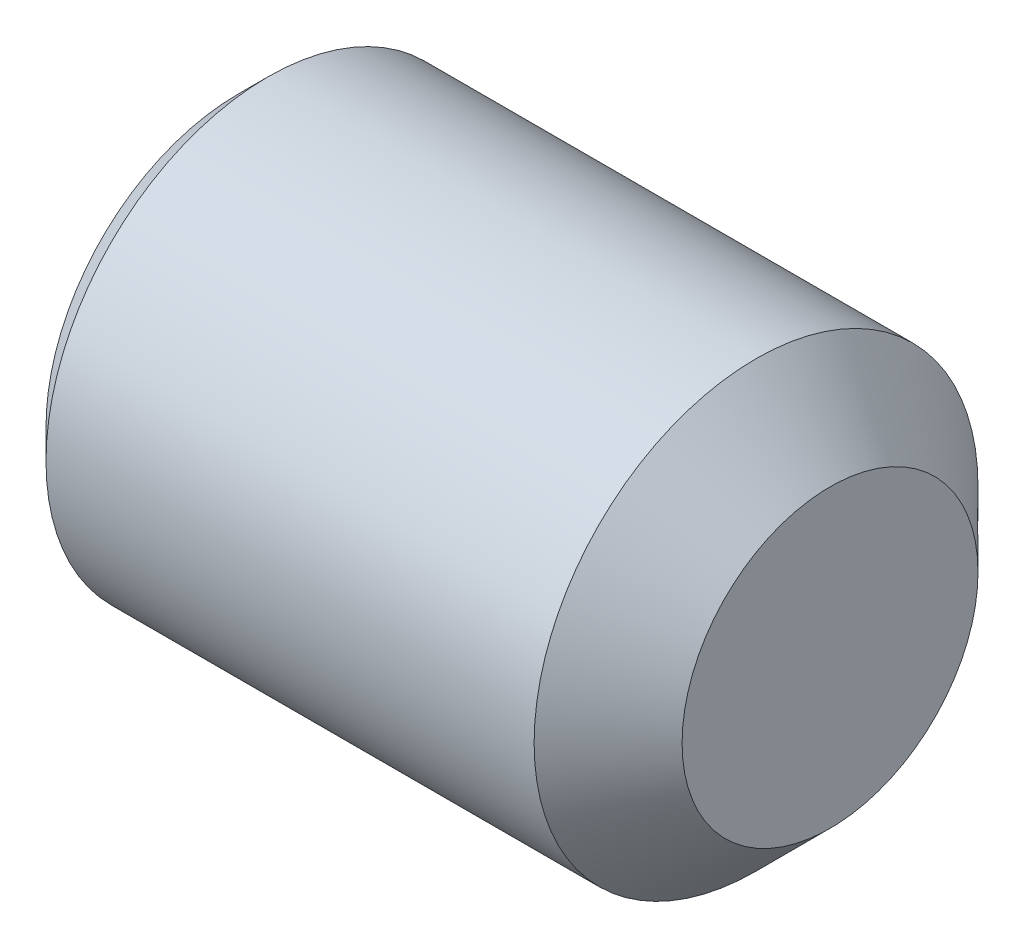
ISO-10303-21;
HEADER;
FILE_DESCRIPTION(('STEP AP214'),'2;1');
FILE_NAME('part.step','',(''),(''),'','','');
FILE_SCHEMA(('AUTOMOTIVE_DESIGN { 1 0 10303 214 1 1 1 1 }'));
ENDSEC;
DATA;
#1=APPLICATION_CONTEXT('core data for automotive mechanical design processes');
#2=APPLICATION_PROTOCOL_DEFINITION('international standard','automotive_design',2000,#1);
#3=PRODUCT_CONTEXT('',#1,'mechanical');
#4=PRODUCT('Part','Part','',(#3));
#5=PRODUCT_RELATED_PRODUCT_CATEGORY('part','',(#4));
#6=PRODUCT_DEFINITION_FORMATION('','',#4);
#7=PRODUCT_DEFINITION_CONTEXT('part definition',#1,'design');
#8=PRODUCT_DEFINITION('design','',#6,#7);
#9=PRODUCT_DEFINITION_SHAPE('','',#8);
#10=(LENGTH_UNIT() NAMED_UNIT(*) SI_UNIT(.MILLI.,.METRE.));
#11=(NAMED_UNIT(*) PLANE_ANGLE_UNIT() SI_UNIT($,.RADIAN.));
#12=(NAMED_UNIT(*) SI_UNIT($,.STERADIAN.) SOLID_ANGLE_UNIT());
#13=UNCERTAINTY_MEASURE_WITH_UNIT(LENGTH_MEASURE(1.E-05),#10,'distance_accuracy_value','');
#14=(GEOMETRIC_REPRESENTATION_CONTEXT(3) GLOBAL_UNCERTAINTY_ASSIGNED_CONTEXT((#13)) GLOBAL_UNIT_ASSIGNED_CONTEXT((#10,
#11,#12)) REPRESENTATION_CONTEXT('',''));
#15=CARTESIAN_POINT('',(0.,0.,0.));
#16=DIRECTION('',(0.,0.,1.));
#17=DIRECTION('',(1.,0.,0.));
#18=AXIS2_PLACEMENT_3D('',#15,#16,#17);
#19=CARTESIAN_POINT('',(1.2000000000002,0.,0.));
#20=DIRECTION('',(-1.,0.,0.));
#21=DIRECTION('',(0.,0.,1.));
#22=AXIS2_PLACEMENT_3D('',#19,#20,#21);
#23=CONICAL_SURFACE('',#22,0.74911197427352,1.04719755119653);
#24=CARTESIAN_POINT('',(1.63250000000026,0.,-3.33066907387547E-13));
#25=VERTEX_POINT('',#24);
#26=VERTEX_LOOP('',#25);
#27=FACE_BOUND('',#26,.T.);
#28=CARTESIAN_POINT('',(1.20000000000007,0.,0.));
#29=DIRECTION('',(-1.,0.,0.));
#30=DIRECTION('',(0.,0.,1.));
#31=AXIS2_PLACEMENT_3D('',#28,#29,#30);
#32=CIRCLE('',#31,0.749111974273742);
#33=CARTESIAN_POINT('',(1.20000000000004,0.37455598713682,-0.648750000000088));
#34=VERTEX_POINT('',#33);
#35=CARTESIAN_POINT('',(1.20000000000004,-0.37455598713682,-0.648750000000088));
#36=VERTEX_POINT('',#35);
#37=EDGE_CURVE('E139',#34,#36,#32,.T.);
#38=ORIENTED_EDGE('',*,*,#37,.T.);
#39=CARTESIAN_POINT('',(1.20000000000007,0.,0.));
#40=DIRECTION('',(-1.,0.,0.));
#41=DIRECTION('',(0.,0.,1.));
#42=AXIS2_PLACEMENT_3D('',#39,#40,#41);
#43=CIRCLE('',#42,0.749111974273742);
#44=CARTESIAN_POINT('',(1.20000000000004,-0.749111974273641,0.));
#45=VERTEX_POINT('',#44);
#46=EDGE_CURVE('E93',#36,#45,#43,.T.);
#47=ORIENTED_EDGE('',*,*,#46,.T.);
#48=CARTESIAN_POINT('',(1.20000000000007,0.,0.));
#49=DIRECTION('',(-1.,0.,0.));
#50=DIRECTION('',(0.,0.,1.));
#51=AXIS2_PLACEMENT_3D('',#48,#49,#50);
#52=CIRCLE('',#51,0.749111974273742);
#53=CARTESIAN_POINT('',(1.20000000000004,-0.37455598713682,0.648750000000088));
#54=VERTEX_POINT('',#53);
#55=EDGE_CURVE('E88',#45,#54,#52,.T.);
#56=ORIENTED_EDGE('',*,*,#55,.T.);
#57=CARTESIAN_POINT('',(1.20000000000007,0.,0.));
#58=DIRECTION('',(-1.,0.,0.));
#59=DIRECTION('',(0.,0.,1.));
#60=AXIS2_PLACEMENT_3D('',#57,#58,#59);
#61=CIRCLE('',#60,0.749111974273742);
#62=CARTESIAN_POINT('',(1.20000000000004,0.37455598713682,0.648750000000087));
#63=VERTEX_POINT('',#62);
#64=EDGE_CURVE('E20',#54,#63,#61,.T.);
#65=ORIENTED_EDGE('',*,*,#64,.T.);
#66=CARTESIAN_POINT('',(1.20000000000007,0.,0.));
#67=DIRECTION('',(-1.,0.,0.));
#68=DIRECTION('',(0.,0.,1.));
#69=AXIS2_PLACEMENT_3D('',#66,#67,#68);
#70=CIRCLE('',#69,0.749111974273742);
#71=CARTESIAN_POINT('',(1.20000000000004,0.749111974273641,0.));
#72=VERTEX_POINT('',#71);
#73=EDGE_CURVE('E114',#63,#72,#70,.T.);
#74=ORIENTED_EDGE('',*,*,#73,.T.);
#75=CARTESIAN_POINT('',(1.20000000000007,0.,0.));
#76=DIRECTION('',(-1.,0.,0.));
#77=DIRECTION('',(0.,0.,1.));
#78=AXIS2_PLACEMENT_3D('',#75,#76,#77);
#79=CIRCLE('',#78,0.749111974273742);
#80=EDGE_CURVE('E141',#72,#34,#79,.T.);
#81=ORIENTED_EDGE('',*,*,#80,.T.);
#82=EDGE_LOOP('',(#38,#47,#56,#65,#74,#81));
#83=FACE_BOUND('',#82,.T.);
#84=ADVANCED_FACE('F17',(#27,#83),#23,.F.);
#85=CARTESIAN_POINT('',(1.2,0.749111974273539,-1.2975));
#86=DIRECTION('',(1.,0.,0.));
#87=DIRECTION('',(0.,0.,-1.));
#88=AXIS2_PLACEMENT_3D('',#85,#86,#87);
#89=PLANE('',#88);
#90=DIRECTION('',(0.,-0.866025403784439,-0.5));
#91=VECTOR('',#90,1.);
#92=CARTESIAN_POINT('',(1.2,-0.749111974273539,0.4325));
#93=LINE('',#92,#91);
#94=CARTESIAN_POINT('',(1.2,0.,0.864999999999999));
#95=VERTEX_POINT('',#94);
#96=EDGE_CURVE('E106',#54,#95,#93,.F.);
#97=ORIENTED_EDGE('',*,*,#96,.T.);
#98=DIRECTION('',(0.,-0.866025403784439,0.5));
#99=VECTOR('',#98,1.);
#100=CARTESIAN_POINT('',(1.2,0.,0.864999999999999));
#101=LINE('',#100,#99);
#102=EDGE_CURVE('E112',#95,#63,#101,.F.);
#103=ORIENTED_EDGE('',*,*,#102,.T.);
#104=ORIENTED_EDGE('',*,*,#64,.F.);
#105=EDGE_LOOP('',(#97,#103,#104));
#106=FACE_BOUND('',#105,.T.);
#107=ADVANCED_FACE('F109',(#106),#89,.F.);
#108=CARTESIAN_POINT('',(1.2,0.749111974273539,-1.2975));
#109=DIRECTION('',(1.,0.,0.));
#110=DIRECTION('',(0.,0.,-1.));
#111=AXIS2_PLACEMENT_3D('',#108,#109,#110);
#112=PLANE('',#111);
#113=DIRECTION('',(0.,-0.866025403784439,0.5));
#114=VECTOR('',#113,1.);
#115=CARTESIAN_POINT('',(1.2,0.,0.864999999999999));
#116=LINE('',#115,#114);
#117=CARTESIAN_POINT('',(1.2,0.74911197427354,0.432499999999999));
#118=VERTEX_POINT('',#117);
#119=EDGE_CURVE('E150',#63,#118,#116,.F.);
#120=ORIENTED_EDGE('',*,*,#119,.T.);
#121=DIRECTION('',(0.,0.,1.));
#122=VECTOR('',#121,1.);
#123=CARTESIAN_POINT('',(1.2,0.74911197427354,0.432499999999999));
#124=LINE('',#123,#122);
#125=EDGE_CURVE('E148',#118,#72,#124,.F.);
#126=ORIENTED_EDGE('',*,*,#125,.T.);
#127=ORIENTED_EDGE('',*,*,#73,.F.);
#128=EDGE_LOOP('',(#120,#126,#127));
#129=FACE_BOUND('',#128,.T.);
#130=ADVANCED_FACE('F149',(#129),#112,.F.);
#131=CARTESIAN_POINT('',(1.2,0.749111974273539,-1.2975));
#132=DIRECTION('',(1.,0.,0.));
#133=DIRECTION('',(0.,0.,-1.));
#134=AXIS2_PLACEMENT_3D('',#131,#132,#133);
#135=PLANE('',#134);
#136=DIRECTION('',(0.,0.,1.));
#137=VECTOR('',#136,1.);
#138=CARTESIAN_POINT('',(1.2,0.74911197427354,0.432499999999999));
#139=LINE('',#138,#137);
#140=CARTESIAN_POINT('',(1.2,0.74911197427354,-0.4325));
#141=VERTEX_POINT('',#140);
#142=EDGE_CURVE('E155',#72,#141,#139,.F.);
#143=ORIENTED_EDGE('',*,*,#142,.T.);
#144=DIRECTION('',(0.,0.866025403784439,0.5));
#145=VECTOR('',#144,1.);
#146=CARTESIAN_POINT('',(1.2,0.74911197427354,-0.4325));
#147=LINE('',#146,#145);
#148=EDGE_CURVE('E162',#141,#34,#147,.F.);
#149=ORIENTED_EDGE('',*,*,#148,.T.);
#150=ORIENTED_EDGE('',*,*,#80,.F.);
#151=EDGE_LOOP('',(#143,#149,#150));
#152=FACE_BOUND('',#151,.T.);
#153=ADVANCED_FACE('F159',(#152),#135,.F.);
#154=CARTESIAN_POINT('',(1.2,0.749111974273539,-1.2975));
#155=DIRECTION('',(1.,0.,0.));
#156=DIRECTION('',(0.,0.,-1.));
#157=AXIS2_PLACEMENT_3D('',#154,#155,#156);
#158=PLANE('',#157);
#159=DIRECTION('',(0.,0.866025403784439,0.5));
#160=VECTOR('',#159,1.);
#161=CARTESIAN_POINT('',(1.2,0.74911197427354,-0.4325));
#162=LINE('',#161,#160);
#163=CARTESIAN_POINT('',(1.2,0.,-0.865));
#164=VERTEX_POINT('',#163);
#165=EDGE_CURVE('E212',#34,#164,#162,.F.);
#166=ORIENTED_EDGE('',*,*,#165,.T.);
#167=DIRECTION('',(0.,0.866025403784439,-0.5));
#168=VECTOR('',#167,1.);
#169=CARTESIAN_POINT('',(1.2,0.,-0.865));
#170=LINE('',#169,#168);
#171=EDGE_CURVE('E218',#164,#36,#170,.F.);
#172=ORIENTED_EDGE('',*,*,#171,.T.);
#173=ORIENTED_EDGE('',*,*,#37,.F.);
#174=EDGE_LOOP('',(#166,#172,#173));
#175=FACE_BOUND('',#174,.T.);
#176=ADVANCED_FACE('F338',(#175),#158,.F.);
#177=CARTESIAN_POINT('',(1.2,0.749111974273539,-1.2975));
#178=DIRECTION('',(1.,0.,0.));
#179=DIRECTION('',(0.,0.,-1.));
#180=AXIS2_PLACEMENT_3D('',#177,#178,#179);
#181=PLANE('',#180);
#182=DIRECTION('',(0.,0.866025403784439,-0.5));
#183=VECTOR('',#182,1.);
#184=CARTESIAN_POINT('',(1.2,0.,-0.865));
#185=LINE('',#184,#183);
#186=CARTESIAN_POINT('',(1.2,-0.749111974273539,-0.4325));
#187=VERTEX_POINT('',#186);
#188=EDGE_CURVE('E226',#36,#187,#185,.F.);
#189=ORIENTED_EDGE('',*,*,#188,.T.);
#190=DIRECTION('',(0.,0.,-1.));
#191=VECTOR('',#190,1.);
#192=CARTESIAN_POINT('',(1.2,-0.749111974273539,-0.4325));
#193=LINE('',#192,#191);
#194=EDGE_CURVE('E240',#187,#45,#193,.F.);
#195=ORIENTED_EDGE('',*,*,#194,.T.);
#196=ORIENTED_EDGE('',*,*,#46,.F.);
#197=EDGE_LOOP('',(#189,#195,#196));
#198=FACE_BOUND('',#197,.T.);
#199=ADVANCED_FACE('F345',(#198),#181,.F.);
#200=CARTESIAN_POINT('',(1.2,0.749111974273539,-1.2975));
#201=DIRECTION('',(1.,0.,0.));
#202=DIRECTION('',(0.,0.,-1.));
#203=AXIS2_PLACEMENT_3D('',#200,#201,#202);
#204=PLANE('',#203);
#205=DIRECTION('',(0.,0.,-1.));
#206=VECTOR('',#205,1.);
#207=CARTESIAN_POINT('',(1.2,-0.749111974273539,-0.4325));
#208=LINE('',#207,#206);
#209=CARTESIAN_POINT('',(1.2,-0.749111974273539,0.4325));
#210=VERTEX_POINT('',#209);
#211=EDGE_CURVE('E101',#45,#210,#208,.F.);
#212=ORIENTED_EDGE('',*,*,#211,.T.);
#213=DIRECTION('',(0.,-0.866025403784439,-0.5));
#214=VECTOR('',#213,1.);
#215=CARTESIAN_POINT('',(1.2,-0.749111974273539,0.4325));
#216=LINE('',#215,#214);
#217=EDGE_CURVE('E97',#210,#54,#216,.F.);
#218=ORIENTED_EDGE('',*,*,#217,.T.);
#219=ORIENTED_EDGE('',*,*,#55,.F.);
#220=EDGE_LOOP('',(#212,#218,#219));
#221=FACE_BOUND('',#220,.T.);
#222=ADVANCED_FACE('F100',(#221),#204,.F.);
#223=CARTESIAN_POINT('',(1.2,-0.749111974273539,0.4325));
#224=DIRECTION('',(0.,-0.5,0.866025403784439));
#225=DIRECTION('',(0.,-0.866025403784439,-0.5));
#226=AXIS2_PLACEMENT_3D('',#223,#224,#225);
#227=PLANE('',#226);
#228=DIRECTION('',(1.,0.,0.));
#229=VECTOR('',#228,1.);
#230=CARTESIAN_POINT('',(1.2,0.,0.864999999999999));
#231=LINE('',#230,#229);
#232=CARTESIAN_POINT('',(0.,0.,0.864999999999999));
#233=VERTEX_POINT('',#232);
#234=EDGE_CURVE('E117',#233,#95,#231,.T.);
#235=ORIENTED_EDGE('',*,*,#234,.T.);
#236=ORIENTED_EDGE('',*,*,#96,.F.);
#237=ORIENTED_EDGE('',*,*,#217,.F.);
#238=DIRECTION('',(1.,0.,0.));
#239=VECTOR('',#238,1.);
#240=CARTESIAN_POINT('',(1.2,-0.749111974273539,0.4325));
#241=LINE('',#240,#239);
#242=CARTESIAN_POINT('',(0.,-0.749111974273539,0.4325));
#243=VERTEX_POINT('',#242);
#244=EDGE_CURVE('E128',#210,#243,#241,.F.);
#245=ORIENTED_EDGE('',*,*,#244,.T.);
#246=DIRECTION('',(0.,0.866025403784439,0.499999999999999));
#247=VECTOR('',#246,1.);
#248=CARTESIAN_POINT('',(0.,-0.74911197427354,0.4325));
#249=LINE('',#248,#247);
#250=EDGE_CURVE('E125',#243,#233,#249,.T.);
#251=ORIENTED_EDGE('',*,*,#250,.T.);
#252=EDGE_LOOP('',(#235,#236,#237,#245,#251));
#253=FACE_BOUND('',#252,.T.);
#254=ADVANCED_FACE('F115',(#253),#227,.F.);
#255=CARTESIAN_POINT('',(1.2,0.,0.864999999999999));
#256=DIRECTION('',(0.,0.5,0.866025403784439));
#257=DIRECTION('',(0.,-0.866025403784439,0.5));
#258=AXIS2_PLACEMENT_3D('',#255,#256,#257);
#259=PLANE('',#258);
#260=DIRECTION('',(1.,0.,0.));
#261=VECTOR('',#260,1.);
#262=CARTESIAN_POINT('',(1.2,0.74911197427354,0.432499999999999));
#263=LINE('',#262,#261);
#264=CARTESIAN_POINT('',(0.,0.74911197427354,0.432499999999999));
#265=VERTEX_POINT('',#264);
#266=EDGE_CURVE('E156',#265,#118,#263,.T.);
#267=ORIENTED_EDGE('',*,*,#266,.T.);
#268=ORIENTED_EDGE('',*,*,#119,.F.);
#269=ORIENTED_EDGE('',*,*,#102,.F.);
#270=ORIENTED_EDGE('',*,*,#234,.F.);
#271=DIRECTION('',(0.,0.866025403784439,-0.5));
#272=VECTOR('',#271,1.);
#273=CARTESIAN_POINT('',(0.,0.,0.864999999999999));
#274=LINE('',#273,#272);
#275=EDGE_CURVE('E127',#233,#265,#274,.T.);
#276=ORIENTED_EDGE('',*,*,#275,.T.);
#277=EDGE_LOOP('',(#267,#268,#269,#270,#276));
#278=FACE_BOUND('',#277,.T.);
#279=ADVANCED_FACE('F194',(#278),#259,.F.);
#280=CARTESIAN_POINT('',(1.2,0.74911197427354,0.432499999999999));
#281=DIRECTION('',(0.,1.,0.));
#282=DIRECTION('',(0.,0.,1.));
#283=AXIS2_PLACEMENT_3D('',#280,#281,#282);
#284=PLANE('',#283);
#285=DIRECTION('',(1.,0.,0.));
#286=VECTOR('',#285,1.);
#287=CARTESIAN_POINT('',(1.2,0.74911197427354,-0.4325));
#288=LINE('',#287,#286);
#289=CARTESIAN_POINT('',(0.,0.74911197427354,-0.4325));
#290=VERTEX_POINT('',#289);
#291=EDGE_CURVE('E166',#290,#141,#288,.T.);
#292=ORIENTED_EDGE('',*,*,#291,.T.);
#293=ORIENTED_EDGE('',*,*,#142,.F.);
#294=ORIENTED_EDGE('',*,*,#125,.F.);
#295=ORIENTED_EDGE('',*,*,#266,.F.);
#296=DIRECTION('',(0.,0.,-1.));
#297=VECTOR('',#296,1.);
#298=CARTESIAN_POINT('',(0.,0.74911197427354,0.));
#299=LINE('',#298,#297);
#300=EDGE_CURVE('E174',#265,#290,#299,.T.);
#301=ORIENTED_EDGE('',*,*,#300,.T.);
#302=EDGE_LOOP('',(#292,#293,#294,#295,#301));
#303=FACE_BOUND('',#302,.T.);
#304=ADVANCED_FACE('F164',(#303),#284,.F.);
#305=CARTESIAN_POINT('',(1.2,0.74911197427354,-0.4325));
#306=DIRECTION('',(0.,0.5,-0.866025403784439));
#307=DIRECTION('',(0.,0.866025403784439,0.5));
#308=AXIS2_PLACEMENT_3D('',#305,#306,#307);
#309=PLANE('',#308);
#310=DIRECTION('',(1.,0.,0.));
#311=VECTOR('',#310,1.);
#312=CARTESIAN_POINT('',(1.2,0.,-0.865));
#313=LINE('',#312,#311);
#314=CARTESIAN_POINT('',(0.,0.,-0.865));
#315=VERTEX_POINT('',#314);
#316=EDGE_CURVE('E214',#315,#164,#313,.T.);
#317=ORIENTED_EDGE('',*,*,#316,.T.);
#318=ORIENTED_EDGE('',*,*,#165,.F.);
#319=ORIENTED_EDGE('',*,*,#148,.F.);
#320=ORIENTED_EDGE('',*,*,#291,.F.);
#321=DIRECTION('',(0.,-0.866025403784439,-0.5));
#322=VECTOR('',#321,1.);
#323=CARTESIAN_POINT('',(0.,0.74911197427354,-0.4325));
#324=LINE('',#323,#322);
#325=EDGE_CURVE('E176',#290,#315,#324,.T.);
#326=ORIENTED_EDGE('',*,*,#325,.T.);
#327=EDGE_LOOP('',(#317,#318,#319,#320,#326));
#328=FACE_BOUND('',#327,.T.);
#329=ADVANCED_FACE('F377',(#328),#309,.F.);
#330=CARTESIAN_POINT('',(1.2,0.,-0.865));
#331=DIRECTION('',(0.,-0.5,-0.866025403784439));
#332=DIRECTION('',(0.,0.866025403784439,-0.5));
#333=AXIS2_PLACEMENT_3D('',#330,#331,#332);
#334=PLANE('',#333);
#335=DIRECTION('',(1.,0.,0.));
#336=VECTOR('',#335,1.);
#337=CARTESIAN_POINT('',(1.2,-0.749111974273539,-0.4325));
#338=LINE('',#337,#336);
#339=CARTESIAN_POINT('',(0.,-0.749111974273539,-0.4325));
#340=VERTEX_POINT('',#339);
#341=EDGE_CURVE('E236',#340,#187,#338,.T.);
#342=ORIENTED_EDGE('',*,*,#341,.T.);
#343=ORIENTED_EDGE('',*,*,#188,.F.);
#344=ORIENTED_EDGE('',*,*,#171,.F.);
#345=ORIENTED_EDGE('',*,*,#316,.F.);
#346=DIRECTION('',(0.,-0.866025403784439,0.5));
#347=VECTOR('',#346,1.);
#348=CARTESIAN_POINT('',(0.,0.,-0.865));
#349=LINE('',#348,#347);
#350=EDGE_CURVE('E35',#315,#340,#349,.T.);
#351=ORIENTED_EDGE('',*,*,#350,.T.);
#352=EDGE_LOOP('',(#342,#343,#344,#345,#351));
#353=FACE_BOUND('',#352,.T.);
#354=ADVANCED_FACE('F275',(#353),#334,.F.);
#355=CARTESIAN_POINT('',(1.2,-0.749111974273539,-0.4325));
#356=DIRECTION('',(0.,-1.,0.));
#357=DIRECTION('',(0.,0.,-1.));
#358=AXIS2_PLACEMENT_3D('',#355,#356,#357);
#359=PLANE('',#358);
#360=ORIENTED_EDGE('',*,*,#244,.F.);
#361=ORIENTED_EDGE('',*,*,#211,.F.);
#362=ORIENTED_EDGE('',*,*,#194,.F.);
#363=ORIENTED_EDGE('',*,*,#341,.F.);
#364=DIRECTION('',(0.,0.,-1.));
#365=VECTOR('',#364,1.);
#366=CARTESIAN_POINT('',(0.,-0.74911197427354,0.));
#367=LINE('',#366,#365);
#368=EDGE_CURVE('E136',#340,#243,#367,.F.);
#369=ORIENTED_EDGE('',*,*,#368,.T.);
#370=EDGE_LOOP('',(#360,#361,#362,#363,#369));
#371=FACE_BOUND('',#370,.T.);
#372=ADVANCED_FACE('F266',(#371),#359,.F.);
#373=CARTESIAN_POINT('',(4.,0.,0.));
#374=DIRECTION('',(-1.,0.,0.));
#375=DIRECTION('',(0.,0.,1.));
#376=AXIS2_PLACEMENT_3D('',#373,#374,#375);
#377=PLANE('',#376);
#378=CARTESIAN_POINT('',(4.0000000000191,0.,0.));
#379=DIRECTION('',(-1.,0.,0.));
#380=DIRECTION('',(0.,0.,1.));
#381=AXIS2_PLACEMENT_3D('',#378,#379,#380);
#382=CIRCLE('',#381,0.999999999976353);
#383=CARTESIAN_POINT('',(4.0000000000191,0.,0.999999999976353));
#384=VERTEX_POINT('',#383);
#385=EDGE_CURVE('E134',#384,#384,#382,.T.);
#386=ORIENTED_EDGE('',*,*,#385,.F.);
#387=EDGE_LOOP('',(#386));
#388=FACE_BOUND('',#387,.T.);
#389=ADVANCED_FACE('F264',(#388),#377,.F.);
#390=CARTESIAN_POINT('',(0.,1.299,0.));
#391=DIRECTION('',(1.,0.,0.));
#392=DIRECTION('',(0.,0.,-1.));
#393=AXIS2_PLACEMENT_3D('',#390,#391,#392);
#394=PLANE('',#393);
#395=CARTESIAN_POINT('',(-5.6843418860808E-11,0.,0.));
#396=DIRECTION('',(1.,0.,0.));
#397=DIRECTION('',(0.,1.,0.));
#398=AXIS2_PLACEMENT_3D('',#395,#396,#397);
#399=CIRCLE('',#398,1.29899999990357);
#400=CARTESIAN_POINT('',(-5.68434305972965E-11,1.29899999990357,0.));
#401=VERTEX_POINT('',#400);
#402=EDGE_CURVE('E131',#401,#401,#399,.T.);
#403=ORIENTED_EDGE('',*,*,#402,.F.);
#404=EDGE_LOOP('',(#403));
#405=FACE_BOUND('',#404,.T.);
#406=ORIENTED_EDGE('',*,*,#350,.F.);
#407=ORIENTED_EDGE('',*,*,#325,.F.);
#408=ORIENTED_EDGE('',*,*,#300,.F.);
#409=ORIENTED_EDGE('',*,*,#275,.F.);
#410=ORIENTED_EDGE('',*,*,#250,.F.);
#411=ORIENTED_EDGE('',*,*,#368,.F.);
#412=EDGE_LOOP('',(#406,#407,#408,#409,#410,#411));
#413=FACE_BOUND('',#412,.T.);
#414=ADVANCED_FACE('F199',(#405,#413),#394,.F.);
#415=CARTESIAN_POINT('',(3.50000000008777,0.,0.));
#416=DIRECTION('',(-1.,0.,0.));
#417=DIRECTION('',(0.,0.,1.));
#418=AXIS2_PLACEMENT_3D('',#415,#416,#417);
#419=CONICAL_SURFACE('',#418,1.49999999990769,0.785398163397448);
#420=CARTESIAN_POINT('',(3.5,0.,0.));
#421=DIRECTION('',(-1.,0.,0.));
#422=DIRECTION('',(0.,0.,1.));
#423=AXIS2_PLACEMENT_3D('',#420,#421,#422);
#424=CIRCLE('',#423,1.5);
#425=CARTESIAN_POINT('',(3.5,0.,1.5));
#426=VERTEX_POINT('',#425);
#427=EDGE_CURVE('E26',#426,#426,#424,.T.);
#428=ORIENTED_EDGE('',*,*,#427,.F.);
#429=EDGE_LOOP('',(#428));
#430=FACE_BOUND('',#429,.T.);
#431=ORIENTED_EDGE('',*,*,#385,.T.);
#432=EDGE_LOOP('',(#431));
#433=FACE_BOUND('',#432,.T.);
#434=ADVANCED_FACE('F257',(#430,#433),#419,.T.);
#435=CARTESIAN_POINT('',(0.200999999947271,0.,0.));
#436=DIRECTION('',(1.,0.,0.));
#437=DIRECTION('',(0.,1.,0.));
#438=AXIS2_PLACEMENT_3D('',#435,#436,#437);
#439=CONICAL_SURFACE('',#438,1.49999999990769,0.785398163397448);
#440=CARTESIAN_POINT('',(0.200999999999998,0.,0.));
#441=DIRECTION('',(-1.,0.,0.));
#442=DIRECTION('',(0.,0.,1.));
#443=AXIS2_PLACEMENT_3D('',#440,#441,#442);
#444=CIRCLE('',#443,1.5);
#445=CARTESIAN_POINT('',(0.200999999999998,0.,1.5));
#446=VERTEX_POINT('',#445);
#447=EDGE_CURVE('E10',#446,#446,#444,.F.);
#448=ORIENTED_EDGE('',*,*,#447,.F.);
#449=EDGE_LOOP('',(#448));
#450=FACE_BOUND('',#449,.T.);
#451=ORIENTED_EDGE('',*,*,#402,.T.);
#452=EDGE_LOOP('',(#451));
#453=FACE_BOUND('',#452,.T.);
#454=ADVANCED_FACE('F260',(#450,#453),#439,.T.);
#455=CARTESIAN_POINT('',(-0.277777777777778,0.,0.));
#456=DIRECTION('',(-1.,0.,0.));
#457=DIRECTION('',(0.,0.,1.));
#458=AXIS2_PLACEMENT_3D('',#455,#456,#457);
#459=CYLINDRICAL_SURFACE('',#458,1.5);
#460=ORIENTED_EDGE('',*,*,#447,.T.);
#461=EDGE_LOOP('',(#460));
#462=FACE_BOUND('',#461,.T.);
#463=ORIENTED_EDGE('',*,*,#427,.T.);
#464=EDGE_LOOP('',(#463));
#465=FACE_BOUND('',#464,.T.);
#466=ADVANCED_FACE('F255',(#462,#465),#459,.T.);
#467=CLOSED_SHELL('',(#84,#107,#130,#153,#176,#199,#222,#254,#279,#304,#329,#354,#372,#389,#414,
#434,#454,#466));
#468=MANIFOLD_SOLID_BREP('B1',#467);
#469=ADVANCED_BREP_SHAPE_REPRESENTATION('',(#18,#468),#14);
#470=SHAPE_DEFINITION_REPRESENTATION(#9,#469);
ENDSEC;
END-ISO-10303-21;
